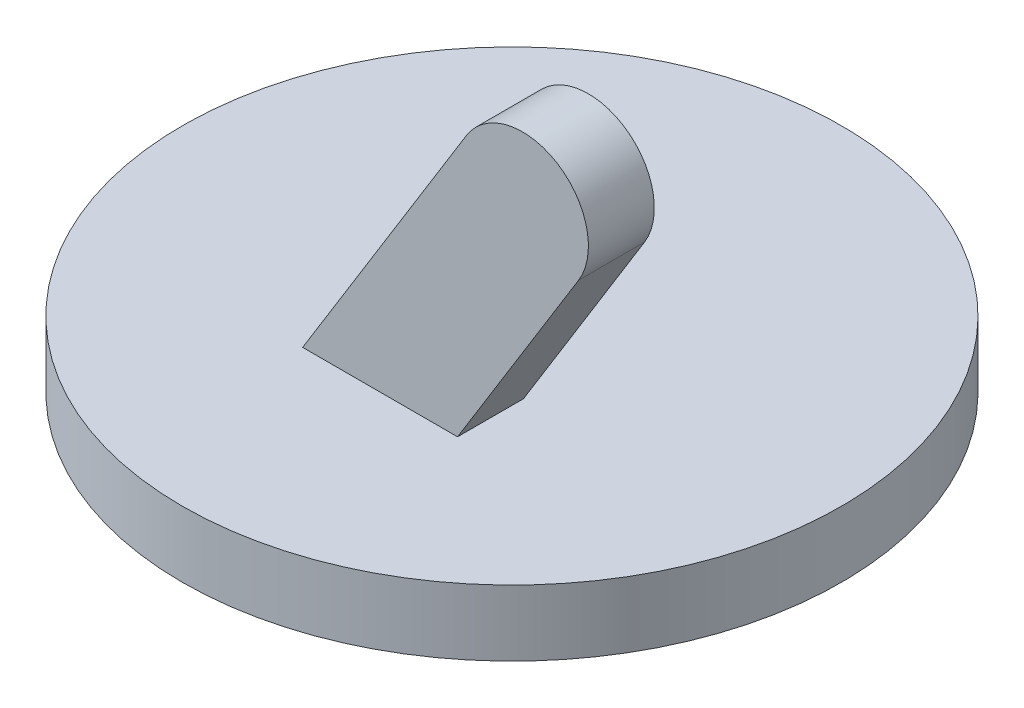
ISO-10303-21;
HEADER;
FILE_DESCRIPTION(('STEP AP214'),'2;1');
FILE_NAME('part.step','',(''),(''),'','','');
FILE_SCHEMA(('AUTOMOTIVE_DESIGN { 1 0 10303 214 1 1 1 1 }'));
ENDSEC;
DATA;
#1=APPLICATION_CONTEXT('core data for automotive mechanical design processes');
#2=APPLICATION_PROTOCOL_DEFINITION('international standard','automotive_design',2000,#1);
#3=PRODUCT_CONTEXT('',#1,'mechanical');
#4=PRODUCT('Part','Part','',(#3));
#5=PRODUCT_RELATED_PRODUCT_CATEGORY('part','',(#4));
#6=PRODUCT_DEFINITION_FORMATION('','',#4);
#7=PRODUCT_DEFINITION_CONTEXT('part definition',#1,'design');
#8=PRODUCT_DEFINITION('design','',#6,#7);
#9=PRODUCT_DEFINITION_SHAPE('','',#8);
#10=(LENGTH_UNIT() NAMED_UNIT(*) SI_UNIT(.MILLI.,.METRE.));
#11=(NAMED_UNIT(*) PLANE_ANGLE_UNIT() SI_UNIT($,.RADIAN.));
#12=(NAMED_UNIT(*) SI_UNIT($,.STERADIAN.) SOLID_ANGLE_UNIT());
#13=UNCERTAINTY_MEASURE_WITH_UNIT(LENGTH_MEASURE(1.E-05),#10,'distance_accuracy_value','');
#14=(GEOMETRIC_REPRESENTATION_CONTEXT(3) GLOBAL_UNCERTAINTY_ASSIGNED_CONTEXT((#13)) GLOBAL_UNIT_ASSIGNED_CONTEXT((#10,
#11,#12)) REPRESENTATION_CONTEXT('',''));
#15=CARTESIAN_POINT('',(0.,0.,0.));
#16=DIRECTION('',(0.,0.,1.));
#17=DIRECTION('',(1.,0.,0.));
#18=AXIS2_PLACEMENT_3D('',#15,#16,#17);
#19=CARTESIAN_POINT('',(0.,5.,0.));
#20=DIRECTION('',(0.,-1.,0.));
#21=DIRECTION('',(0.,0.,-1.));
#22=AXIS2_PLACEMENT_3D('',#19,#20,#21);
#23=CYLINDRICAL_SURFACE('',#22,25.);
#24=CARTESIAN_POINT('',(0.,5.,0.));
#25=DIRECTION('',(0.,1.,0.));
#26=DIRECTION('',(0.,0.,1.));
#27=AXIS2_PLACEMENT_3D('',#24,#25,#26);
#28=CIRCLE('',#27,25.);
#29=CARTESIAN_POINT('',(0.,5.,25.));
#30=VERTEX_POINT('',#29);
#31=EDGE_CURVE('E11',#30,#30,#28,.T.);
#32=ORIENTED_EDGE('',*,*,#31,.F.);
#33=EDGE_LOOP('',(#32));
#34=FACE_BOUND('',#33,.T.);
#35=CARTESIAN_POINT('',(0.,0.,0.));
#36=DIRECTION('',(0.,1.,0.));
#37=DIRECTION('',(0.,0.,1.));
#38=AXIS2_PLACEMENT_3D('',#35,#36,#37);
#39=CIRCLE('',#38,25.);
#40=CARTESIAN_POINT('',(0.,0.,25.));
#41=VERTEX_POINT('',#40);
#42=EDGE_CURVE('E44',#41,#41,#39,.T.);
#43=ORIENTED_EDGE('',*,*,#42,.T.);
#44=EDGE_LOOP('',(#43));
#45=FACE_BOUND('',#44,.T.);
#46=ADVANCED_FACE('F41',(#34,#45),#23,.T.);
#47=CARTESIAN_POINT('',(0.,5.,0.));
#48=DIRECTION('',(0.,1.,0.));
#49=DIRECTION('',(0.,0.,1.));
#50=AXIS2_PLACEMENT_3D('',#47,#48,#49);
#51=PLANE('',#50);
#52=DIRECTION('',(1.,0.,0.));
#53=VECTOR('',#52,1.);
#54=CARTESIAN_POINT('',(-5.8755112673759,5.,10.));
#55=LINE('',#54,#53);
#56=CARTESIAN_POINT('',(-5.8755112673759,5.,10.));
#57=VERTEX_POINT('',#56);
#58=CARTESIAN_POINT('',(5.87551126737635,5.,10.));
#59=VERTEX_POINT('',#58);
#60=EDGE_CURVE('E91',#57,#59,#55,.T.);
#61=ORIENTED_EDGE('',*,*,#60,.F.);
#62=DIRECTION('',(0.,0.,-1.));
#63=VECTOR('',#62,1.);
#64=CARTESIAN_POINT('',(-5.8755112673759,5.,10.));
#65=LINE('',#64,#63);
#66=CARTESIAN_POINT('',(-5.8755112673759,5.,5.));
#67=VERTEX_POINT('',#66);
#68=EDGE_CURVE('E103',#57,#67,#65,.T.);
#69=ORIENTED_EDGE('',*,*,#68,.T.);
#70=DIRECTION('',(1.,0.,0.));
#71=VECTOR('',#70,1.);
#72=CARTESIAN_POINT('',(-5.8755112673759,5.,5.));
#73=LINE('',#72,#71);
#74=CARTESIAN_POINT('',(5.87551126737635,5.,5.));
#75=VERTEX_POINT('',#74);
#76=EDGE_CURVE('E107',#67,#75,#73,.T.);
#77=ORIENTED_EDGE('',*,*,#76,.T.);
#78=DIRECTION('',(0.,0.,-1.));
#79=VECTOR('',#78,1.);
#80=CARTESIAN_POINT('',(5.87551126737635,5.,10.));
#81=LINE('',#80,#79);
#82=EDGE_CURVE('E55',#59,#75,#81,.T.);
#83=ORIENTED_EDGE('',*,*,#82,.F.);
#84=EDGE_LOOP('',(#61,#69,#77,#83));
#85=FACE_BOUND('',#84,.T.);
#86=ORIENTED_EDGE('',*,*,#31,.T.);
#87=EDGE_LOOP('',(#86));
#88=FACE_BOUND('',#87,.T.);
#89=ADVANCED_FACE('F123',(#85,#88),#51,.T.);
#90=CARTESIAN_POINT('',(0.,0.,0.));
#91=DIRECTION('',(0.,1.,0.));
#92=DIRECTION('',(0.,0.,1.));
#93=AXIS2_PLACEMENT_3D('',#90,#91,#92);
#94=PLANE('',#93);
#95=ORIENTED_EDGE('',*,*,#42,.F.);
#96=EDGE_LOOP('',(#95));
#97=FACE_BOUND('',#96,.T.);
#98=ADVANCED_FACE('F121',(#97),#94,.F.);
#99=CARTESIAN_POINT('',(5.87551126737635,5.,10.));
#100=DIRECTION('',(-0.850989773053936,0.525182259941832,0.));
#101=DIRECTION('',(-0.525182259941832,-0.850989773053936,0.));
#102=AXIS2_PLACEMENT_3D('',#99,#100,#101);
#103=PLANE('',#102);
#104=DIRECTION('',(0.525182259941832,0.850989773053936,0.));
#105=VECTOR('',#104,1.);
#106=CARTESIAN_POINT('',(5.87551126737635,5.,5.));
#107=LINE('',#106,#105);
#108=CARTESIAN_POINT('',(15.0549488652697,19.8740887002908,5.));
#109=VERTEX_POINT('',#108);
#110=EDGE_CURVE('E96',#75,#109,#107,.T.);
#111=ORIENTED_EDGE('',*,*,#110,.T.);
#112=DIRECTION('',(0.,0.,-1.));
#113=VECTOR('',#112,1.);
#114=CARTESIAN_POINT('',(15.0549488652697,19.8740887002908,10.));
#115=LINE('',#114,#113);
#116=CARTESIAN_POINT('',(15.0549488652697,19.8740887002908,10.));
#117=VERTEX_POINT('',#116);
#118=EDGE_CURVE('E94',#117,#109,#115,.T.);
#119=ORIENTED_EDGE('',*,*,#118,.F.);
#120=DIRECTION('',(0.525182259941832,0.850989773053936,0.));
#121=VECTOR('',#120,1.);
#122=CARTESIAN_POINT('',(5.87551126737635,5.,10.));
#123=LINE('',#122,#121);
#124=EDGE_CURVE('E85',#59,#117,#123,.T.);
#125=ORIENTED_EDGE('',*,*,#124,.F.);
#126=ORIENTED_EDGE('',*,*,#82,.T.);
#127=EDGE_LOOP('',(#111,#119,#125,#126));
#128=FACE_BOUND('',#127,.T.);
#129=ADVANCED_FACE('F95',(#128),#103,.F.);
#130=CARTESIAN_POINT('',(10.8,22.5,10.));
#131=DIRECTION('',(0.,0.,-1.));
#132=DIRECTION('',(-1.,0.,0.));
#133=AXIS2_PLACEMENT_3D('',#130,#131,#132);
#134=CYLINDRICAL_SURFACE('',#133,5.);
#135=CARTESIAN_POINT('',(10.8,22.5,5.));
#136=DIRECTION('',(0.,0.,1.));
#137=DIRECTION('',(1.,0.,0.));
#138=AXIS2_PLACEMENT_3D('',#135,#136,#137);
#139=CIRCLE('',#138,5.);
#140=CARTESIAN_POINT('',(6.54505113473037,25.1259112997093,5.));
#141=VERTEX_POINT('',#140);
#142=EDGE_CURVE('E111',#109,#141,#139,.T.);
#143=ORIENTED_EDGE('',*,*,#142,.T.);
#144=DIRECTION('',(0.,0.,-1.));
#145=VECTOR('',#144,1.);
#146=CARTESIAN_POINT('',(6.54505113473037,25.1259112997093,10.));
#147=LINE('',#146,#145);
#148=CARTESIAN_POINT('',(6.54505113473037,25.1259112997093,10.));
#149=VERTEX_POINT('',#148);
#150=EDGE_CURVE('E99',#149,#141,#147,.T.);
#151=ORIENTED_EDGE('',*,*,#150,.F.);
#152=CARTESIAN_POINT('',(10.8,22.5,10.));
#153=DIRECTION('',(0.,0.,1.));
#154=DIRECTION('',(1.,0.,0.));
#155=AXIS2_PLACEMENT_3D('',#152,#153,#154);
#156=CIRCLE('',#155,5.);
#157=EDGE_CURVE('E88',#117,#149,#156,.T.);
#158=ORIENTED_EDGE('',*,*,#157,.F.);
#159=ORIENTED_EDGE('',*,*,#118,.T.);
#160=EDGE_LOOP('',(#143,#151,#158,#159));
#161=FACE_BOUND('',#160,.T.);
#162=ADVANCED_FACE('F101',(#161),#134,.T.);
#163=CARTESIAN_POINT('',(6.54505113473037,25.1259112997093,10.));
#164=DIRECTION('',(0.850989773053925,-0.52518225994185,0.));
#165=DIRECTION('',(0.52518225994185,0.850989773053925,0.));
#166=AXIS2_PLACEMENT_3D('',#163,#164,#165);
#167=PLANE('',#166);
#168=DIRECTION('',(-0.52518225994185,-0.850989773053925,0.));
#169=VECTOR('',#168,1.);
#170=CARTESIAN_POINT('',(6.54505113473037,25.1259112997093,5.));
#171=LINE('',#170,#169);
#172=EDGE_CURVE('E80',#141,#67,#171,.T.);
#173=ORIENTED_EDGE('',*,*,#172,.T.);
#174=ORIENTED_EDGE('',*,*,#68,.F.);
#175=DIRECTION('',(-0.52518225994185,-0.850989773053925,0.));
#176=VECTOR('',#175,1.);
#177=CARTESIAN_POINT('',(6.54505113473037,25.1259112997093,10.));
#178=LINE('',#177,#176);
#179=EDGE_CURVE('E64',#149,#57,#178,.T.);
#180=ORIENTED_EDGE('',*,*,#179,.F.);
#181=ORIENTED_EDGE('',*,*,#150,.T.);
#182=EDGE_LOOP('',(#173,#174,#180,#181));
#183=FACE_BOUND('',#182,.T.);
#184=ADVANCED_FACE('F163',(#183),#167,.F.);
#185=CARTESIAN_POINT('',(10.8,22.5,10.));
#186=DIRECTION('',(0.,0.,1.));
#187=DIRECTION('',(1.,0.,0.));
#188=AXIS2_PLACEMENT_3D('',#185,#186,#187);
#189=PLANE('',#188);
#190=ORIENTED_EDGE('',*,*,#60,.T.);
#191=ORIENTED_EDGE('',*,*,#124,.T.);
#192=ORIENTED_EDGE('',*,*,#157,.T.);
#193=ORIENTED_EDGE('',*,*,#179,.T.);
#194=EDGE_LOOP('',(#190,#191,#192,#193));
#195=FACE_BOUND('',#194,.T.);
#196=ADVANCED_FACE('F86',(#195),#189,.T.);
#197=CARTESIAN_POINT('',(10.8,22.5,5.));
#198=DIRECTION('',(0.,0.,1.));
#199=DIRECTION('',(1.,0.,0.));
#200=AXIS2_PLACEMENT_3D('',#197,#198,#199);
#201=PLANE('',#200);
#202=ORIENTED_EDGE('',*,*,#76,.F.);
#203=ORIENTED_EDGE('',*,*,#172,.F.);
#204=ORIENTED_EDGE('',*,*,#142,.F.);
#205=ORIENTED_EDGE('',*,*,#110,.F.);
#206=EDGE_LOOP('',(#202,#203,#204,#205));
#207=FACE_BOUND('',#206,.T.);
#208=ADVANCED_FACE('F180',(#207),#201,.F.);
#209=CLOSED_SHELL('',(#46,#89,#98,#129,#162,#184,#196,#208));
#210=MANIFOLD_SOLID_BREP('B2',#209);
#211=ADVANCED_BREP_SHAPE_REPRESENTATION('',(#18,#210),#14);
#212=SHAPE_DEFINITION_REPRESENTATION(#9,#211);
ENDSEC;
END-ISO-10303-21;
